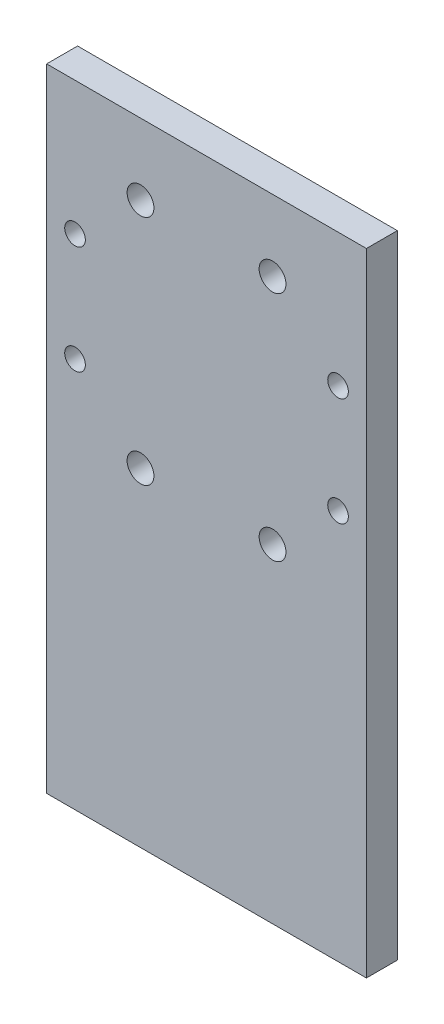
ISO-10303-21;
HEADER;
FILE_DESCRIPTION(('STEP AP214'),'2;1');
FILE_NAME('part.step','',(''),(''),'','','');
FILE_SCHEMA(('AUTOMOTIVE_DESIGN { 1 0 10303 214 1 1 1 1 }'));
ENDSEC;
DATA;
#1=APPLICATION_CONTEXT('core data for automotive mechanical design processes');
#2=APPLICATION_PROTOCOL_DEFINITION('international standard','automotive_design',2000,#1);
#3=PRODUCT_CONTEXT('',#1,'mechanical');
#4=PRODUCT('Part','Part','',(#3));
#5=PRODUCT_RELATED_PRODUCT_CATEGORY('part','',(#4));
#6=PRODUCT_DEFINITION_FORMATION('','',#4);
#7=PRODUCT_DEFINITION_CONTEXT('part definition',#1,'design');
#8=PRODUCT_DEFINITION('design','',#6,#7);
#9=PRODUCT_DEFINITION_SHAPE('','',#8);
#10=(LENGTH_UNIT() NAMED_UNIT(*) SI_UNIT(.MILLI.,.METRE.));
#11=(NAMED_UNIT(*) PLANE_ANGLE_UNIT() SI_UNIT($,.RADIAN.));
#12=(NAMED_UNIT(*) SI_UNIT($,.STERADIAN.) SOLID_ANGLE_UNIT());
#13=UNCERTAINTY_MEASURE_WITH_UNIT(LENGTH_MEASURE(1.E-05),#10,'distance_accuracy_value','');
#14=(GEOMETRIC_REPRESENTATION_CONTEXT(3) GLOBAL_UNCERTAINTY_ASSIGNED_CONTEXT((#13)) GLOBAL_UNIT_ASSIGNED_CONTEXT((#10,
#11,#12)) REPRESENTATION_CONTEXT('',''));
#15=CARTESIAN_POINT('',(0.,0.,0.));
#16=DIRECTION('',(0.,0.,1.));
#17=DIRECTION('',(1.,0.,0.));
#18=AXIS2_PLACEMENT_3D('',#15,#16,#17);
#19=CARTESIAN_POINT('',(0.,0.,6.));
#20=DIRECTION('',(0.,0.,1.));
#21=DIRECTION('',(1.,0.,0.));
#22=AXIS2_PLACEMENT_3D('',#19,#20,#21);
#23=PLANE('',#22);
#24=CARTESIAN_POINT('',(12.8,2.45000000000001,6.));
#25=DIRECTION('',(0.,0.,1.));
#26=DIRECTION('',(1.,0.,0.));
#27=AXIS2_PLACEMENT_3D('',#24,#25,#26);
#28=CIRCLE('',#27,2.6);
#29=CARTESIAN_POINT('',(15.4,2.45000000000001,6.));
#30=VERTEX_POINT('',#29);
#31=EDGE_CURVE('E151',#30,#30,#28,.T.);
#32=ORIENTED_EDGE('',*,*,#31,.F.);
#33=EDGE_LOOP('',(#32));
#34=FACE_BOUND('',#33,.T.);
#35=CARTESIAN_POINT('',(-12.8,47.45,6.));
#36=DIRECTION('',(0.,0.,1.));
#37=DIRECTION('',(1.,0.,0.));
#38=AXIS2_PLACEMENT_3D('',#35,#36,#37);
#39=CIRCLE('',#38,2.6);
#40=CARTESIAN_POINT('',(-10.2,47.45,6.));
#41=VERTEX_POINT('',#40);
#42=EDGE_CURVE('E139',#41,#41,#39,.T.);
#43=ORIENTED_EDGE('',*,*,#42,.F.);
#44=EDGE_LOOP('',(#43));
#45=FACE_BOUND('',#44,.T.);
#46=CARTESIAN_POINT('',(25.5,14.45,6.));
#47=DIRECTION('',(0.,0.,1.));
#48=DIRECTION('',(-1.,0.,0.));
#49=AXIS2_PLACEMENT_3D('',#46,#47,#48);
#50=CIRCLE('',#49,2.00000000000001);
#51=CARTESIAN_POINT('',(23.5,14.45,6.));
#52=VERTEX_POINT('',#51);
#53=EDGE_CURVE('E127',#52,#52,#50,.T.);
#54=ORIENTED_EDGE('',*,*,#53,.F.);
#55=EDGE_LOOP('',(#54));
#56=FACE_BOUND('',#55,.T.);
#57=CARTESIAN_POINT('',(-25.5,35.45,6.));
#58=DIRECTION('',(0.,0.,1.));
#59=DIRECTION('',(1.,0.,0.));
#60=AXIS2_PLACEMENT_3D('',#57,#58,#59);
#61=CIRCLE('',#60,2.00000000000001);
#62=CARTESIAN_POINT('',(-23.5,35.45,6.));
#63=VERTEX_POINT('',#62);
#64=EDGE_CURVE('E106',#63,#63,#61,.T.);
#65=ORIENTED_EDGE('',*,*,#64,.F.);
#66=EDGE_LOOP('',(#65));
#67=FACE_BOUND('',#66,.T.);
#68=DIRECTION('',(0.,1.,0.));
#69=VECTOR('',#68,1.);
#70=CARTESIAN_POINT('',(31.,61.25,6.));
#71=LINE('',#70,#69);
#72=CARTESIAN_POINT('',(31.,-61.25,6.));
#73=VERTEX_POINT('',#72);
#74=CARTESIAN_POINT('',(31.,61.25,6.));
#75=VERTEX_POINT('',#74);
#76=EDGE_CURVE('E91',#73,#75,#71,.T.);
#77=ORIENTED_EDGE('',*,*,#76,.T.);
#78=DIRECTION('',(-1.,0.,0.));
#79=VECTOR('',#78,1.);
#80=CARTESIAN_POINT('',(-31.,61.25,6.));
#81=LINE('',#80,#79);
#82=CARTESIAN_POINT('',(-31.,61.25,6.));
#83=VERTEX_POINT('',#82);
#84=EDGE_CURVE('E86',#75,#83,#81,.T.);
#85=ORIENTED_EDGE('',*,*,#84,.T.);
#86=DIRECTION('',(0.,-1.,0.));
#87=VECTOR('',#86,1.);
#88=CARTESIAN_POINT('',(-31.,61.25,6.));
#89=LINE('',#88,#87);
#90=CARTESIAN_POINT('',(-31.,-61.25,6.));
#91=VERTEX_POINT('',#90);
#92=EDGE_CURVE('E89',#83,#91,#89,.T.);
#93=ORIENTED_EDGE('',*,*,#92,.T.);
#94=DIRECTION('',(1.,0.,0.));
#95=VECTOR('',#94,1.);
#96=CARTESIAN_POINT('',(-31.,-61.25,6.));
#97=LINE('',#96,#95);
#98=EDGE_CURVE('E56',#91,#73,#97,.T.);
#99=ORIENTED_EDGE('',*,*,#98,.T.);
#100=EDGE_LOOP('',(#77,#85,#93,#99));
#101=FACE_BOUND('',#100,.T.);
#102=CARTESIAN_POINT('',(-25.5,14.45,6.));
#103=DIRECTION('',(0.,0.,1.));
#104=DIRECTION('',(1.,0.,0.));
#105=AXIS2_PLACEMENT_3D('',#102,#103,#104);
#106=CIRCLE('',#105,2.00000000000001);
#107=CARTESIAN_POINT('',(-23.5,14.45,6.));
#108=VERTEX_POINT('',#107);
#109=EDGE_CURVE('E121',#108,#108,#106,.T.);
#110=ORIENTED_EDGE('',*,*,#109,.F.);
#111=EDGE_LOOP('',(#110));
#112=FACE_BOUND('',#111,.T.);
#113=CARTESIAN_POINT('',(25.5,35.45,6.));
#114=DIRECTION('',(0.,0.,1.));
#115=DIRECTION('',(-1.,0.,0.));
#116=AXIS2_PLACEMENT_3D('',#113,#114,#115);
#117=CIRCLE('',#116,2.00000000000001);
#118=CARTESIAN_POINT('',(23.5,35.45,6.));
#119=VERTEX_POINT('',#118);
#120=EDGE_CURVE('E133',#119,#119,#117,.T.);
#121=ORIENTED_EDGE('',*,*,#120,.F.);
#122=EDGE_LOOP('',(#121));
#123=FACE_BOUND('',#122,.T.);
#124=CARTESIAN_POINT('',(12.8,47.45,6.));
#125=DIRECTION('',(0.,0.,1.));
#126=DIRECTION('',(-1.,0.,0.));
#127=AXIS2_PLACEMENT_3D('',#124,#125,#126);
#128=CIRCLE('',#127,2.6);
#129=CARTESIAN_POINT('',(10.2,47.45,6.));
#130=VERTEX_POINT('',#129);
#131=EDGE_CURVE('E145',#130,#130,#128,.T.);
#132=ORIENTED_EDGE('',*,*,#131,.F.);
#133=EDGE_LOOP('',(#132));
#134=FACE_BOUND('',#133,.T.);
#135=CARTESIAN_POINT('',(-12.8,2.45000000000001,6.));
#136=DIRECTION('',(0.,0.,1.));
#137=DIRECTION('',(-1.,0.,0.));
#138=AXIS2_PLACEMENT_3D('',#135,#136,#137);
#139=CIRCLE('',#138,2.6);
#140=CARTESIAN_POINT('',(-15.4,2.45000000000001,6.));
#141=VERTEX_POINT('',#140);
#142=EDGE_CURVE('E157',#141,#141,#139,.T.);
#143=ORIENTED_EDGE('',*,*,#142,.F.);
#144=EDGE_LOOP('',(#143));
#145=FACE_BOUND('',#144,.T.);
#146=ADVANCED_FACE('F39',(#34,#45,#56,#67,#101,#112,#123,#134,#145),#23,.T.);
#147=CARTESIAN_POINT('',(0.,0.,0.));
#148=DIRECTION('',(0.,0.,1.));
#149=DIRECTION('',(1.,0.,0.));
#150=AXIS2_PLACEMENT_3D('',#147,#148,#149);
#151=PLANE('',#150);
#152=DIRECTION('',(0.,1.,0.));
#153=VECTOR('',#152,1.);
#154=CARTESIAN_POINT('',(31.,61.25,0.));
#155=LINE('',#154,#153);
#156=CARTESIAN_POINT('',(31.,-61.25,0.));
#157=VERTEX_POINT('',#156);
#158=CARTESIAN_POINT('',(31.,61.25,0.));
#159=VERTEX_POINT('',#158);
#160=EDGE_CURVE('E103',#157,#159,#155,.T.);
#161=ORIENTED_EDGE('',*,*,#160,.F.);
#162=DIRECTION('',(1.,0.,0.));
#163=VECTOR('',#162,1.);
#164=CARTESIAN_POINT('',(-31.,-61.25,0.));
#165=LINE('',#164,#163);
#166=CARTESIAN_POINT('',(-31.,-61.25,0.));
#167=VERTEX_POINT('',#166);
#168=EDGE_CURVE('E79',#167,#157,#165,.T.);
#169=ORIENTED_EDGE('',*,*,#168,.F.);
#170=DIRECTION('',(0.,-1.,0.));
#171=VECTOR('',#170,1.);
#172=CARTESIAN_POINT('',(-31.,61.25,0.));
#173=LINE('',#172,#171);
#174=CARTESIAN_POINT('',(-31.,61.25,0.));
#175=VERTEX_POINT('',#174);
#176=EDGE_CURVE('E73',#175,#167,#173,.T.);
#177=ORIENTED_EDGE('',*,*,#176,.F.);
#178=DIRECTION('',(-1.,0.,0.));
#179=VECTOR('',#178,1.);
#180=CARTESIAN_POINT('',(-31.,61.25,0.));
#181=LINE('',#180,#179);
#182=EDGE_CURVE('E95',#159,#175,#181,.T.);
#183=ORIENTED_EDGE('',*,*,#182,.F.);
#184=EDGE_LOOP('',(#161,#169,#177,#183));
#185=FACE_BOUND('',#184,.T.);
#186=CARTESIAN_POINT('',(-25.5,35.45,0.));
#187=DIRECTION('',(0.,0.,1.));
#188=DIRECTION('',(1.,0.,0.));
#189=AXIS2_PLACEMENT_3D('',#186,#187,#188);
#190=CIRCLE('',#189,2.00000000000001);
#191=CARTESIAN_POINT('',(-23.5,35.45,0.));
#192=VERTEX_POINT('',#191);
#193=EDGE_CURVE('E118',#192,#192,#190,.T.);
#194=ORIENTED_EDGE('',*,*,#193,.T.);
#195=EDGE_LOOP('',(#194));
#196=FACE_BOUND('',#195,.T.);
#197=CARTESIAN_POINT('',(-25.5,14.45,0.));
#198=DIRECTION('',(0.,0.,1.));
#199=DIRECTION('',(1.,0.,0.));
#200=AXIS2_PLACEMENT_3D('',#197,#198,#199);
#201=CIRCLE('',#200,2.00000000000001);
#202=CARTESIAN_POINT('',(-23.5,14.45,0.));
#203=VERTEX_POINT('',#202);
#204=EDGE_CURVE('E124',#203,#203,#201,.T.);
#205=ORIENTED_EDGE('',*,*,#204,.T.);
#206=EDGE_LOOP('',(#205));
#207=FACE_BOUND('',#206,.T.);
#208=CARTESIAN_POINT('',(25.5,14.45,0.));
#209=DIRECTION('',(0.,0.,1.));
#210=DIRECTION('',(-1.,0.,0.));
#211=AXIS2_PLACEMENT_3D('',#208,#209,#210);
#212=CIRCLE('',#211,2.00000000000001);
#213=CARTESIAN_POINT('',(23.5,14.45,0.));
#214=VERTEX_POINT('',#213);
#215=EDGE_CURVE('E130',#214,#214,#212,.T.);
#216=ORIENTED_EDGE('',*,*,#215,.T.);
#217=EDGE_LOOP('',(#216));
#218=FACE_BOUND('',#217,.T.);
#219=CARTESIAN_POINT('',(25.5,35.45,0.));
#220=DIRECTION('',(0.,0.,1.));
#221=DIRECTION('',(-1.,0.,0.));
#222=AXIS2_PLACEMENT_3D('',#219,#220,#221);
#223=CIRCLE('',#222,2.00000000000001);
#224=CARTESIAN_POINT('',(23.5,35.45,0.));
#225=VERTEX_POINT('',#224);
#226=EDGE_CURVE('E136',#225,#225,#223,.T.);
#227=ORIENTED_EDGE('',*,*,#226,.T.);
#228=EDGE_LOOP('',(#227));
#229=FACE_BOUND('',#228,.T.);
#230=CARTESIAN_POINT('',(-12.8,47.45,0.));
#231=DIRECTION('',(0.,0.,1.));
#232=DIRECTION('',(1.,0.,0.));
#233=AXIS2_PLACEMENT_3D('',#230,#231,#232);
#234=CIRCLE('',#233,2.6);
#235=CARTESIAN_POINT('',(-10.2,47.45,0.));
#236=VERTEX_POINT('',#235);
#237=EDGE_CURVE('E142',#236,#236,#234,.T.);
#238=ORIENTED_EDGE('',*,*,#237,.T.);
#239=EDGE_LOOP('',(#238));
#240=FACE_BOUND('',#239,.T.);
#241=CARTESIAN_POINT('',(12.8,47.45,0.));
#242=DIRECTION('',(0.,0.,1.));
#243=DIRECTION('',(-1.,0.,0.));
#244=AXIS2_PLACEMENT_3D('',#241,#242,#243);
#245=CIRCLE('',#244,2.6);
#246=CARTESIAN_POINT('',(10.2,47.45,0.));
#247=VERTEX_POINT('',#246);
#248=EDGE_CURVE('E148',#247,#247,#245,.T.);
#249=ORIENTED_EDGE('',*,*,#248,.T.);
#250=EDGE_LOOP('',(#249));
#251=FACE_BOUND('',#250,.T.);
#252=CARTESIAN_POINT('',(12.8,2.45000000000001,0.));
#253=DIRECTION('',(0.,0.,1.));
#254=DIRECTION('',(1.,0.,0.));
#255=AXIS2_PLACEMENT_3D('',#252,#253,#254);
#256=CIRCLE('',#255,2.6);
#257=CARTESIAN_POINT('',(15.4,2.45000000000001,0.));
#258=VERTEX_POINT('',#257);
#259=EDGE_CURVE('E154',#258,#258,#256,.T.);
#260=ORIENTED_EDGE('',*,*,#259,.T.);
#261=EDGE_LOOP('',(#260));
#262=FACE_BOUND('',#261,.T.);
#263=CARTESIAN_POINT('',(-12.8,2.45000000000001,0.));
#264=DIRECTION('',(0.,0.,1.));
#265=DIRECTION('',(-1.,0.,0.));
#266=AXIS2_PLACEMENT_3D('',#263,#264,#265);
#267=CIRCLE('',#266,2.6);
#268=CARTESIAN_POINT('',(-15.4,2.45000000000001,0.));
#269=VERTEX_POINT('',#268);
#270=EDGE_CURVE('E160',#269,#269,#267,.T.);
#271=ORIENTED_EDGE('',*,*,#270,.T.);
#272=EDGE_LOOP('',(#271));
#273=FACE_BOUND('',#272,.T.);
#274=ADVANCED_FACE('F114',(#185,#196,#207,#218,#229,#240,#251,#262,#273),#151,.F.);
#275=CARTESIAN_POINT('',(31.,61.25,6.));
#276=DIRECTION('',(-1.,0.,0.));
#277=DIRECTION('',(0.,-1.,0.));
#278=AXIS2_PLACEMENT_3D('',#275,#276,#277);
#279=PLANE('',#278);
#280=ORIENTED_EDGE('',*,*,#160,.T.);
#281=DIRECTION('',(0.,0.,-1.));
#282=VECTOR('',#281,1.);
#283=CARTESIAN_POINT('',(31.,61.25,6.));
#284=LINE('',#283,#282);
#285=EDGE_CURVE('E11',#75,#159,#284,.T.);
#286=ORIENTED_EDGE('',*,*,#285,.F.);
#287=ORIENTED_EDGE('',*,*,#76,.F.);
#288=DIRECTION('',(0.,0.,-1.));
#289=VECTOR('',#288,1.);
#290=CARTESIAN_POINT('',(31.,-61.25,6.));
#291=LINE('',#290,#289);
#292=EDGE_CURVE('E99',#73,#157,#291,.T.);
#293=ORIENTED_EDGE('',*,*,#292,.T.);
#294=EDGE_LOOP('',(#280,#286,#287,#293));
#295=FACE_BOUND('',#294,.T.);
#296=ADVANCED_FACE('F41',(#295),#279,.F.);
#297=CARTESIAN_POINT('',(-31.,61.25,6.));
#298=DIRECTION('',(0.,-1.,0.));
#299=DIRECTION('',(0.,0.,-1.));
#300=AXIS2_PLACEMENT_3D('',#297,#298,#299);
#301=PLANE('',#300);
#302=ORIENTED_EDGE('',*,*,#182,.T.);
#303=DIRECTION('',(0.,0.,-1.));
#304=VECTOR('',#303,1.);
#305=CARTESIAN_POINT('',(-31.,61.25,6.));
#306=LINE('',#305,#304);
#307=EDGE_CURVE('E48',#83,#175,#306,.T.);
#308=ORIENTED_EDGE('',*,*,#307,.F.);
#309=ORIENTED_EDGE('',*,*,#84,.F.);
#310=ORIENTED_EDGE('',*,*,#285,.T.);
#311=EDGE_LOOP('',(#302,#308,#309,#310));
#312=FACE_BOUND('',#311,.T.);
#313=ADVANCED_FACE('F94',(#312),#301,.F.);
#314=CARTESIAN_POINT('',(-31.,61.25,6.));
#315=DIRECTION('',(1.,0.,0.));
#316=DIRECTION('',(0.,1.,0.));
#317=AXIS2_PLACEMENT_3D('',#314,#315,#316);
#318=PLANE('',#317);
#319=ORIENTED_EDGE('',*,*,#176,.T.);
#320=DIRECTION('',(0.,0.,-1.));
#321=VECTOR('',#320,1.);
#322=CARTESIAN_POINT('',(-31.,-61.25,6.));
#323=LINE('',#322,#321);
#324=EDGE_CURVE('E96',#91,#167,#323,.T.);
#325=ORIENTED_EDGE('',*,*,#324,.F.);
#326=ORIENTED_EDGE('',*,*,#92,.F.);
#327=ORIENTED_EDGE('',*,*,#307,.T.);
#328=EDGE_LOOP('',(#319,#325,#326,#327));
#329=FACE_BOUND('',#328,.T.);
#330=ADVANCED_FACE('F97',(#329),#318,.F.);
#331=CARTESIAN_POINT('',(-31.,-61.25,6.));
#332=DIRECTION('',(0.,1.,0.));
#333=DIRECTION('',(0.,0.,1.));
#334=AXIS2_PLACEMENT_3D('',#331,#332,#333);
#335=PLANE('',#334);
#336=ORIENTED_EDGE('',*,*,#168,.T.);
#337=ORIENTED_EDGE('',*,*,#292,.F.);
#338=ORIENTED_EDGE('',*,*,#98,.F.);
#339=ORIENTED_EDGE('',*,*,#324,.T.);
#340=EDGE_LOOP('',(#336,#337,#338,#339));
#341=FACE_BOUND('',#340,.T.);
#342=ADVANCED_FACE('F111',(#341),#335,.F.);
#343=CARTESIAN_POINT('',(-25.5,35.45,6.));
#344=DIRECTION('',(0.,0.,-1.));
#345=DIRECTION('',(-1.,0.,0.));
#346=AXIS2_PLACEMENT_3D('',#343,#344,#345);
#347=CYLINDRICAL_SURFACE('',#346,2.00000000000001);
#348=ORIENTED_EDGE('',*,*,#64,.T.);
#349=EDGE_LOOP('',(#348));
#350=FACE_BOUND('',#349,.T.);
#351=ORIENTED_EDGE('',*,*,#193,.F.);
#352=EDGE_LOOP('',(#351));
#353=FACE_BOUND('',#352,.T.);
#354=ADVANCED_FACE('F179',(#350,#353),#347,.F.);
#355=CARTESIAN_POINT('',(-25.5,14.45,6.));
#356=DIRECTION('',(0.,0.,-1.));
#357=DIRECTION('',(-1.,0.,0.));
#358=AXIS2_PLACEMENT_3D('',#355,#356,#357);
#359=CYLINDRICAL_SURFACE('',#358,2.00000000000001);
#360=ORIENTED_EDGE('',*,*,#109,.T.);
#361=EDGE_LOOP('',(#360));
#362=FACE_BOUND('',#361,.T.);
#363=ORIENTED_EDGE('',*,*,#204,.F.);
#364=EDGE_LOOP('',(#363));
#365=FACE_BOUND('',#364,.T.);
#366=ADVANCED_FACE('F233',(#362,#365),#359,.F.);
#367=CARTESIAN_POINT('',(25.5,14.45,6.));
#368=DIRECTION('',(0.,0.,-1.));
#369=DIRECTION('',(-1.,0.,0.));
#370=AXIS2_PLACEMENT_3D('',#367,#368,#369);
#371=CYLINDRICAL_SURFACE('',#370,2.00000000000001);
#372=ORIENTED_EDGE('',*,*,#53,.T.);
#373=EDGE_LOOP('',(#372));
#374=FACE_BOUND('',#373,.T.);
#375=ORIENTED_EDGE('',*,*,#215,.F.);
#376=EDGE_LOOP('',(#375));
#377=FACE_BOUND('',#376,.T.);
#378=ADVANCED_FACE('F242',(#374,#377),#371,.F.);
#379=CARTESIAN_POINT('',(25.5,35.45,6.));
#380=DIRECTION('',(0.,0.,-1.));
#381=DIRECTION('',(-1.,0.,0.));
#382=AXIS2_PLACEMENT_3D('',#379,#380,#381);
#383=CYLINDRICAL_SURFACE('',#382,2.00000000000001);
#384=ORIENTED_EDGE('',*,*,#120,.T.);
#385=EDGE_LOOP('',(#384));
#386=FACE_BOUND('',#385,.T.);
#387=ORIENTED_EDGE('',*,*,#226,.F.);
#388=EDGE_LOOP('',(#387));
#389=FACE_BOUND('',#388,.T.);
#390=ADVANCED_FACE('F251',(#386,#389),#383,.F.);
#391=CARTESIAN_POINT('',(-12.8,47.45,6.));
#392=DIRECTION('',(0.,0.,-1.));
#393=DIRECTION('',(-1.,0.,0.));
#394=AXIS2_PLACEMENT_3D('',#391,#392,#393);
#395=CYLINDRICAL_SURFACE('',#394,2.6);
#396=ORIENTED_EDGE('',*,*,#42,.T.);
#397=EDGE_LOOP('',(#396));
#398=FACE_BOUND('',#397,.T.);
#399=ORIENTED_EDGE('',*,*,#237,.F.);
#400=EDGE_LOOP('',(#399));
#401=FACE_BOUND('',#400,.T.);
#402=ADVANCED_FACE('F261',(#398,#401),#395,.F.);
#403=CARTESIAN_POINT('',(12.8,47.45,6.));
#404=DIRECTION('',(0.,0.,-1.));
#405=DIRECTION('',(-1.,0.,0.));
#406=AXIS2_PLACEMENT_3D('',#403,#404,#405);
#407=CYLINDRICAL_SURFACE('',#406,2.6);
#408=ORIENTED_EDGE('',*,*,#131,.T.);
#409=EDGE_LOOP('',(#408));
#410=FACE_BOUND('',#409,.T.);
#411=ORIENTED_EDGE('',*,*,#248,.F.);
#412=EDGE_LOOP('',(#411));
#413=FACE_BOUND('',#412,.T.);
#414=ADVANCED_FACE('F271',(#410,#413),#407,.F.);
#415=CARTESIAN_POINT('',(12.8,2.45000000000001,6.));
#416=DIRECTION('',(0.,0.,-1.));
#417=DIRECTION('',(-1.,0.,0.));
#418=AXIS2_PLACEMENT_3D('',#415,#416,#417);
#419=CYLINDRICAL_SURFACE('',#418,2.6);
#420=ORIENTED_EDGE('',*,*,#31,.T.);
#421=EDGE_LOOP('',(#420));
#422=FACE_BOUND('',#421,.T.);
#423=ORIENTED_EDGE('',*,*,#259,.F.);
#424=EDGE_LOOP('',(#423));
#425=FACE_BOUND('',#424,.T.);
#426=ADVANCED_FACE('F281',(#422,#425),#419,.F.);
#427=CARTESIAN_POINT('',(-12.8,2.45000000000001,6.));
#428=DIRECTION('',(0.,0.,-1.));
#429=DIRECTION('',(-1.,0.,0.));
#430=AXIS2_PLACEMENT_3D('',#427,#428,#429);
#431=CYLINDRICAL_SURFACE('',#430,2.6);
#432=ORIENTED_EDGE('',*,*,#142,.T.);
#433=EDGE_LOOP('',(#432));
#434=FACE_BOUND('',#433,.T.);
#435=ORIENTED_EDGE('',*,*,#270,.F.);
#436=EDGE_LOOP('',(#435));
#437=FACE_BOUND('',#436,.T.);
#438=ADVANCED_FACE('F166',(#434,#437),#431,.F.);
#439=CLOSED_SHELL('',(#146,#274,#296,#313,#330,#342,#354,#366,#378,#390,#402,#414,#426,#438));
#440=MANIFOLD_SOLID_BREP('B2',#439);
#441=ADVANCED_BREP_SHAPE_REPRESENTATION('',(#18,#440),#14);
#442=SHAPE_DEFINITION_REPRESENTATION(#9,#441);
ENDSEC;
END-ISO-10303-21;
